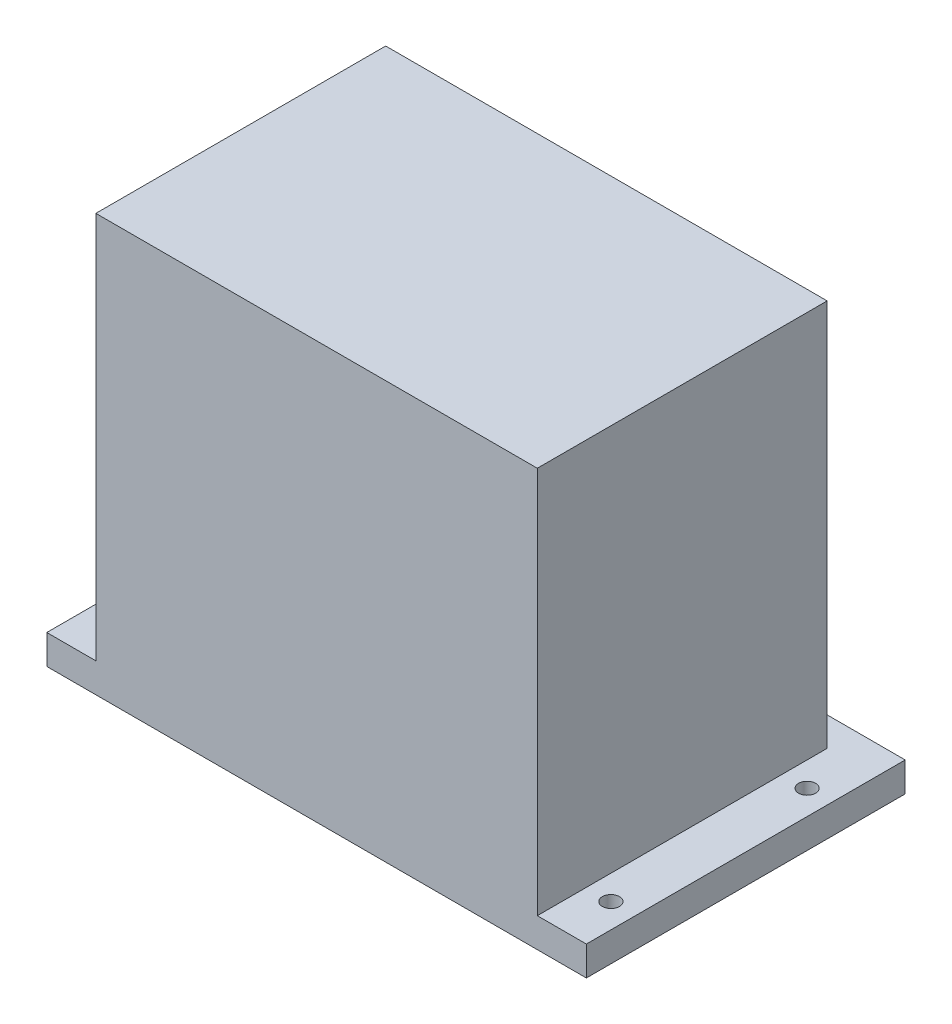
ISO-10303-21;
HEADER;
FILE_DESCRIPTION(('STEP AP214'),'2;1');
FILE_NAME('part.step','',(''),(''),'','','');
FILE_SCHEMA(('AUTOMOTIVE_DESIGN { 1 0 10303 214 1 1 1 1 }'));
ENDSEC;
DATA;
#1=APPLICATION_CONTEXT('core data for automotive mechanical design processes');
#2=APPLICATION_PROTOCOL_DEFINITION('international standard','automotive_design',2000,#1);
#3=PRODUCT_CONTEXT('',#1,'mechanical');
#4=PRODUCT('Part','Part','',(#3));
#5=PRODUCT_RELATED_PRODUCT_CATEGORY('part','',(#4));
#6=PRODUCT_DEFINITION_FORMATION('','',#4);
#7=PRODUCT_DEFINITION_CONTEXT('part definition',#1,'design');
#8=PRODUCT_DEFINITION('design','',#6,#7);
#9=PRODUCT_DEFINITION_SHAPE('','',#8);
#10=(LENGTH_UNIT() NAMED_UNIT(*) SI_UNIT(.MILLI.,.METRE.));
#11=(NAMED_UNIT(*) PLANE_ANGLE_UNIT() SI_UNIT($,.RADIAN.));
#12=(NAMED_UNIT(*) SI_UNIT($,.STERADIAN.) SOLID_ANGLE_UNIT());
#13=UNCERTAINTY_MEASURE_WITH_UNIT(LENGTH_MEASURE(1.E-05),#10,'distance_accuracy_value','');
#14=(GEOMETRIC_REPRESENTATION_CONTEXT(3) GLOBAL_UNCERTAINTY_ASSIGNED_CONTEXT((#13)) GLOBAL_UNIT_ASSIGNED_CONTEXT((#10,
#11,#12)) REPRESENTATION_CONTEXT('',''));
#15=CARTESIAN_POINT('',(0.,0.,0.));
#16=DIRECTION('',(0.,0.,1.));
#17=DIRECTION('',(1.,0.,0.));
#18=AXIS2_PLACEMENT_3D('',#15,#16,#17);
#19=CARTESIAN_POINT('',(55.,6.,0.));
#20=DIRECTION('',(-1.,0.,0.));
#21=DIRECTION('',(0.,0.,1.));
#22=AXIS2_PLACEMENT_3D('',#19,#20,#21);
#23=PLANE('',#22);
#24=DIRECTION('',(0.,0.,-1.));
#25=VECTOR('',#24,1.);
#26=CARTESIAN_POINT('',(55.,0.,0.));
#27=LINE('',#26,#25);
#28=CARTESIAN_POINT('',(55.,0.,32.5));
#29=VERTEX_POINT('',#28);
#30=CARTESIAN_POINT('',(55.,0.,-32.5));
#31=VERTEX_POINT('',#30);
#32=EDGE_CURVE('E199',#29,#31,#27,.T.);
#33=ORIENTED_EDGE('',*,*,#32,.T.);
#34=DIRECTION('',(0.,-1.,0.));
#35=VECTOR('',#34,1.);
#36=CARTESIAN_POINT('',(55.,6.,-32.5));
#37=LINE('',#36,#35);
#38=CARTESIAN_POINT('',(55.,6.,-32.5));
#39=VERTEX_POINT('',#38);
#40=EDGE_CURVE('E53',#39,#31,#37,.T.);
#41=ORIENTED_EDGE('',*,*,#40,.F.);
#42=DIRECTION('',(0.,0.,-1.));
#43=VECTOR('',#42,1.);
#44=CARTESIAN_POINT('',(55.,6.,0.));
#45=LINE('',#44,#43);
#46=CARTESIAN_POINT('',(55.,6.,32.5));
#47=VERTEX_POINT('',#46);
#48=EDGE_CURVE('E332',#47,#39,#45,.T.);
#49=ORIENTED_EDGE('',*,*,#48,.F.);
#50=DIRECTION('',(0.,-1.,0.));
#51=VECTOR('',#50,1.);
#52=CARTESIAN_POINT('',(55.,6.,32.5));
#53=LINE('',#52,#51);
#54=EDGE_CURVE('E11',#47,#29,#53,.T.);
#55=ORIENTED_EDGE('',*,*,#54,.T.);
#56=EDGE_LOOP('',(#33,#41,#49,#55));
#57=FACE_BOUND('',#56,.T.);
#58=ADVANCED_FACE('F43',(#57),#23,.F.);
#59=CARTESIAN_POINT('',(0.,6.,-32.5));
#60=DIRECTION('',(0.,0.,-1.));
#61=DIRECTION('',(-1.,0.,0.));
#62=AXIS2_PLACEMENT_3D('',#59,#60,#61);
#63=PLANE('',#62);
#64=DIRECTION('',(1.,0.,0.));
#65=VECTOR('',#64,1.);
#66=CARTESIAN_POINT('',(0.,0.,-32.5));
#67=LINE('',#66,#65);
#68=CARTESIAN_POINT('',(35.,0.,-32.5));
#69=VERTEX_POINT('',#68);
#70=EDGE_CURVE('E207',#69,#31,#67,.T.);
#71=ORIENTED_EDGE('',*,*,#70,.F.);
#72=DIRECTION('',(0.,-1.,0.));
#73=VECTOR('',#72,1.);
#74=CARTESIAN_POINT('',(35.,6.,-32.5));
#75=LINE('',#74,#73);
#76=CARTESIAN_POINT('',(35.,6.,-32.5));
#77=VERTEX_POINT('',#76);
#78=EDGE_CURVE('E268',#77,#69,#75,.T.);
#79=ORIENTED_EDGE('',*,*,#78,.F.);
#80=DIRECTION('',(1.,0.,0.));
#81=VECTOR('',#80,1.);
#82=CARTESIAN_POINT('',(0.,6.,-32.5));
#83=LINE('',#82,#81);
#84=EDGE_CURVE('E277',#77,#39,#83,.T.);
#85=ORIENTED_EDGE('',*,*,#84,.T.);
#86=ORIENTED_EDGE('',*,*,#40,.T.);
#87=EDGE_LOOP('',(#71,#79,#85,#86));
#88=FACE_BOUND('',#87,.T.);
#89=ADVANCED_FACE('F275',(#88),#63,.T.);
#90=CARTESIAN_POINT('',(35.,6.,0.));
#91=DIRECTION('',(1.,0.,0.));
#92=DIRECTION('',(0.,0.,-1.));
#93=AXIS2_PLACEMENT_3D('',#90,#91,#92);
#94=PLANE('',#93);
#95=DIRECTION('',(0.,0.,1.));
#96=VECTOR('',#95,1.);
#97=CARTESIAN_POINT('',(35.,0.,0.));
#98=LINE('',#97,#96);
#99=CARTESIAN_POINT('',(35.,0.,-27.5));
#100=VERTEX_POINT('',#99);
#101=EDGE_CURVE('E211',#69,#100,#98,.T.);
#102=ORIENTED_EDGE('',*,*,#101,.T.);
#103=DIRECTION('',(0.,-1.,0.));
#104=VECTOR('',#103,1.);
#105=CARTESIAN_POINT('',(35.,6.,-27.5));
#106=LINE('',#105,#104);
#107=CARTESIAN_POINT('',(35.,6.,-27.5));
#108=VERTEX_POINT('',#107);
#109=EDGE_CURVE('E264',#108,#100,#106,.T.);
#110=ORIENTED_EDGE('',*,*,#109,.F.);
#111=DIRECTION('',(0.,0.,1.));
#112=VECTOR('',#111,1.);
#113=CARTESIAN_POINT('',(35.,6.,0.));
#114=LINE('',#113,#112);
#115=EDGE_CURVE('E300',#77,#108,#114,.T.);
#116=ORIENTED_EDGE('',*,*,#115,.F.);
#117=ORIENTED_EDGE('',*,*,#78,.T.);
#118=EDGE_LOOP('',(#102,#110,#116,#117));
#119=FACE_BOUND('',#118,.T.);
#120=ADVANCED_FACE('F290',(#119),#94,.F.);
#121=CARTESIAN_POINT('',(0.,6.,-27.5));
#122=DIRECTION('',(0.,0.,1.));
#123=DIRECTION('',(1.,0.,0.));
#124=AXIS2_PLACEMENT_3D('',#121,#122,#123);
#125=PLANE('',#124);
#126=DIRECTION('',(-1.,0.,0.));
#127=VECTOR('',#126,1.);
#128=CARTESIAN_POINT('',(0.,0.,-27.5));
#129=LINE('',#128,#127);
#130=CARTESIAN_POINT('',(15.,0.,-27.5));
#131=VERTEX_POINT('',#130);
#132=EDGE_CURVE('E214',#100,#131,#129,.T.);
#133=ORIENTED_EDGE('',*,*,#132,.T.);
#134=DIRECTION('',(0.,-1.,0.));
#135=VECTOR('',#134,1.);
#136=CARTESIAN_POINT('',(15.,6.,-27.5));
#137=LINE('',#136,#135);
#138=CARTESIAN_POINT('',(15.,6.,-27.5));
#139=VERTEX_POINT('',#138);
#140=EDGE_CURVE('E260',#139,#131,#137,.T.);
#141=ORIENTED_EDGE('',*,*,#140,.F.);
#142=DIRECTION('',(-1.,0.,0.));
#143=VECTOR('',#142,1.);
#144=CARTESIAN_POINT('',(0.,6.,-27.5));
#145=LINE('',#144,#143);
#146=EDGE_CURVE('E296',#108,#139,#145,.T.);
#147=ORIENTED_EDGE('',*,*,#146,.F.);
#148=ORIENTED_EDGE('',*,*,#109,.T.);
#149=EDGE_LOOP('',(#133,#141,#147,#148));
#150=FACE_BOUND('',#149,.T.);
#151=ADVANCED_FACE('F294',(#150),#125,.F.);
#152=CARTESIAN_POINT('',(15.,6.,0.));
#153=DIRECTION('',(-1.,0.,0.));
#154=DIRECTION('',(0.,0.,1.));
#155=AXIS2_PLACEMENT_3D('',#152,#153,#154);
#156=PLANE('',#155);
#157=DIRECTION('',(0.,0.,-1.));
#158=VECTOR('',#157,1.);
#159=CARTESIAN_POINT('',(15.,0.,0.));
#160=LINE('',#159,#158);
#161=CARTESIAN_POINT('',(15.,0.,-32.5));
#162=VERTEX_POINT('',#161);
#163=EDGE_CURVE('E217',#131,#162,#160,.T.);
#164=ORIENTED_EDGE('',*,*,#163,.T.);
#165=DIRECTION('',(0.,-1.,0.));
#166=VECTOR('',#165,1.);
#167=CARTESIAN_POINT('',(15.,6.,-32.5));
#168=LINE('',#167,#166);
#169=CARTESIAN_POINT('',(15.,6.,-32.5));
#170=VERTEX_POINT('',#169);
#171=EDGE_CURVE('E257',#170,#162,#168,.T.);
#172=ORIENTED_EDGE('',*,*,#171,.F.);
#173=DIRECTION('',(0.,0.,-1.));
#174=VECTOR('',#173,1.);
#175=CARTESIAN_POINT('',(15.,6.,0.));
#176=LINE('',#175,#174);
#177=EDGE_CURVE('E299',#139,#170,#176,.T.);
#178=ORIENTED_EDGE('',*,*,#177,.F.);
#179=ORIENTED_EDGE('',*,*,#140,.T.);
#180=EDGE_LOOP('',(#164,#172,#178,#179));
#181=FACE_BOUND('',#180,.T.);
#182=ADVANCED_FACE('F472',(#181),#156,.F.);
#183=CARTESIAN_POINT('',(0.,6.,-32.5));
#184=DIRECTION('',(0.,0.,-1.));
#185=DIRECTION('',(-1.,0.,0.));
#186=AXIS2_PLACEMENT_3D('',#183,#184,#185);
#187=PLANE('',#186);
#188=DIRECTION('',(1.,0.,0.));
#189=VECTOR('',#188,1.);
#190=CARTESIAN_POINT('',(0.,0.,-32.5));
#191=LINE('',#190,#189);
#192=CARTESIAN_POINT('',(-15.,0.,-32.5));
#193=VERTEX_POINT('',#192);
#194=EDGE_CURVE('E221',#193,#162,#191,.T.);
#195=ORIENTED_EDGE('',*,*,#194,.F.);
#196=DIRECTION('',(0.,-1.,0.));
#197=VECTOR('',#196,1.);
#198=CARTESIAN_POINT('',(-15.,6.,-32.5));
#199=LINE('',#198,#197);
#200=CARTESIAN_POINT('',(-15.,6.,-32.5));
#201=VERTEX_POINT('',#200);
#202=EDGE_CURVE('E254',#201,#193,#199,.T.);
#203=ORIENTED_EDGE('',*,*,#202,.F.);
#204=DIRECTION('',(1.,0.,0.));
#205=VECTOR('',#204,1.);
#206=CARTESIAN_POINT('',(0.,6.,-32.5));
#207=LINE('',#206,#205);
#208=EDGE_CURVE('E304',#201,#170,#207,.T.);
#209=ORIENTED_EDGE('',*,*,#208,.T.);
#210=ORIENTED_EDGE('',*,*,#171,.T.);
#211=EDGE_LOOP('',(#195,#203,#209,#210));
#212=FACE_BOUND('',#211,.T.);
#213=ADVANCED_FACE('F468',(#212),#187,.T.);
#214=CARTESIAN_POINT('',(-15.,6.,0.));
#215=DIRECTION('',(-1.,0.,0.));
#216=DIRECTION('',(0.,0.,1.));
#217=AXIS2_PLACEMENT_3D('',#214,#215,#216);
#218=PLANE('',#217);
#219=DIRECTION('',(0.,0.,-1.));
#220=VECTOR('',#219,1.);
#221=CARTESIAN_POINT('',(-15.,0.,0.));
#222=LINE('',#221,#220);
#223=CARTESIAN_POINT('',(-15.,0.,-27.5));
#224=VERTEX_POINT('',#223);
#225=EDGE_CURVE('E225',#224,#193,#222,.T.);
#226=ORIENTED_EDGE('',*,*,#225,.F.);
#227=DIRECTION('',(0.,-1.,0.));
#228=VECTOR('',#227,1.);
#229=CARTESIAN_POINT('',(-15.,6.,-27.5));
#230=LINE('',#229,#228);
#231=CARTESIAN_POINT('',(-15.,6.,-27.5));
#232=VERTEX_POINT('',#231);
#233=EDGE_CURVE('E251',#232,#224,#230,.T.);
#234=ORIENTED_EDGE('',*,*,#233,.F.);
#235=DIRECTION('',(0.,0.,-1.));
#236=VECTOR('',#235,1.);
#237=CARTESIAN_POINT('',(-15.,6.,0.));
#238=LINE('',#237,#236);
#239=EDGE_CURVE('E312',#232,#201,#238,.T.);
#240=ORIENTED_EDGE('',*,*,#239,.T.);
#241=ORIENTED_EDGE('',*,*,#202,.T.);
#242=EDGE_LOOP('',(#226,#234,#240,#241));
#243=FACE_BOUND('',#242,.T.);
#244=ADVANCED_FACE('F464',(#243),#218,.T.);
#245=CARTESIAN_POINT('',(0.,6.,-27.5));
#246=DIRECTION('',(0.,0.,-1.));
#247=DIRECTION('',(-1.,0.,0.));
#248=AXIS2_PLACEMENT_3D('',#245,#246,#247);
#249=PLANE('',#248);
#250=DIRECTION('',(1.,0.,0.));
#251=VECTOR('',#250,1.);
#252=CARTESIAN_POINT('',(0.,0.,-27.5));
#253=LINE('',#252,#251);
#254=CARTESIAN_POINT('',(-35.,0.,-27.5));
#255=VERTEX_POINT('',#254);
#256=EDGE_CURVE('E229',#255,#224,#253,.T.);
#257=ORIENTED_EDGE('',*,*,#256,.F.);
#258=DIRECTION('',(0.,-1.,0.));
#259=VECTOR('',#258,1.);
#260=CARTESIAN_POINT('',(-35.,6.,-27.5));
#261=LINE('',#260,#259);
#262=CARTESIAN_POINT('',(-35.,6.,-27.5));
#263=VERTEX_POINT('',#262);
#264=EDGE_CURVE('E248',#263,#255,#261,.T.);
#265=ORIENTED_EDGE('',*,*,#264,.F.);
#266=DIRECTION('',(1.,0.,0.));
#267=VECTOR('',#266,1.);
#268=CARTESIAN_POINT('',(0.,6.,-27.5));
#269=LINE('',#268,#267);
#270=EDGE_CURVE('E316',#263,#232,#269,.T.);
#271=ORIENTED_EDGE('',*,*,#270,.T.);
#272=ORIENTED_EDGE('',*,*,#233,.T.);
#273=EDGE_LOOP('',(#257,#265,#271,#272));
#274=FACE_BOUND('',#273,.T.);
#275=ADVANCED_FACE('F461',(#274),#249,.T.);
#276=CARTESIAN_POINT('',(-35.,6.,0.));
#277=DIRECTION('',(1.,0.,0.));
#278=DIRECTION('',(0.,0.,-1.));
#279=AXIS2_PLACEMENT_3D('',#276,#277,#278);
#280=PLANE('',#279);
#281=DIRECTION('',(0.,0.,1.));
#282=VECTOR('',#281,1.);
#283=CARTESIAN_POINT('',(-35.,0.,0.));
#284=LINE('',#283,#282);
#285=CARTESIAN_POINT('',(-35.,0.,-32.5));
#286=VERTEX_POINT('',#285);
#287=EDGE_CURVE('E233',#286,#255,#284,.T.);
#288=ORIENTED_EDGE('',*,*,#287,.F.);
#289=DIRECTION('',(0.,-1.,0.));
#290=VECTOR('',#289,1.);
#291=CARTESIAN_POINT('',(-35.,6.,-32.5));
#292=LINE('',#291,#290);
#293=CARTESIAN_POINT('',(-35.,6.,-32.5));
#294=VERTEX_POINT('',#293);
#295=EDGE_CURVE('E245',#294,#286,#292,.T.);
#296=ORIENTED_EDGE('',*,*,#295,.F.);
#297=DIRECTION('',(0.,0.,1.));
#298=VECTOR('',#297,1.);
#299=CARTESIAN_POINT('',(-35.,6.,0.));
#300=LINE('',#299,#298);
#301=EDGE_CURVE('E176',#294,#263,#300,.T.);
#302=ORIENTED_EDGE('',*,*,#301,.T.);
#303=ORIENTED_EDGE('',*,*,#264,.T.);
#304=EDGE_LOOP('',(#288,#296,#302,#303));
#305=FACE_BOUND('',#304,.T.);
#306=ADVANCED_FACE('F323',(#305),#280,.T.);
#307=CARTESIAN_POINT('',(0.,6.,-32.5));
#308=DIRECTION('',(0.,0.,-1.));
#309=DIRECTION('',(-1.,0.,0.));
#310=AXIS2_PLACEMENT_3D('',#307,#308,#309);
#311=PLANE('',#310);
#312=DIRECTION('',(1.,0.,0.));
#313=VECTOR('',#312,1.);
#314=CARTESIAN_POINT('',(0.,0.,-32.5));
#315=LINE('',#314,#313);
#316=CARTESIAN_POINT('',(-55.,0.,-32.5));
#317=VERTEX_POINT('',#316);
#318=EDGE_CURVE('E237',#317,#286,#315,.T.);
#319=ORIENTED_EDGE('',*,*,#318,.F.);
#320=DIRECTION('',(0.,-1.,0.));
#321=VECTOR('',#320,1.);
#322=CARTESIAN_POINT('',(-55.,6.,-32.5));
#323=LINE('',#322,#321);
#324=CARTESIAN_POINT('',(-55.,6.,-32.5));
#325=VERTEX_POINT('',#324);
#326=EDGE_CURVE('E103',#325,#317,#323,.T.);
#327=ORIENTED_EDGE('',*,*,#326,.F.);
#328=DIRECTION('',(1.,0.,0.));
#329=VECTOR('',#328,1.);
#330=CARTESIAN_POINT('',(0.,6.,-32.5));
#331=LINE('',#330,#329);
#332=EDGE_CURVE('E172',#325,#294,#331,.T.);
#333=ORIENTED_EDGE('',*,*,#332,.T.);
#334=ORIENTED_EDGE('',*,*,#295,.T.);
#335=EDGE_LOOP('',(#319,#327,#333,#334));
#336=FACE_BOUND('',#335,.T.);
#337=ADVANCED_FACE('F328',(#336),#311,.T.);
#338=CARTESIAN_POINT('',(-55.,6.,0.));
#339=DIRECTION('',(-1.,0.,0.));
#340=DIRECTION('',(0.,0.,1.));
#341=AXIS2_PLACEMENT_3D('',#338,#339,#340);
#342=PLANE('',#341);
#343=DIRECTION('',(0.,0.,-1.));
#344=VECTOR('',#343,1.);
#345=CARTESIAN_POINT('',(-55.,0.,0.));
#346=LINE('',#345,#344);
#347=CARTESIAN_POINT('',(-55.,0.,32.5));
#348=VERTEX_POINT('',#347);
#349=EDGE_CURVE('E156',#348,#317,#346,.T.);
#350=ORIENTED_EDGE('',*,*,#349,.F.);
#351=DIRECTION('',(0.,-1.,0.));
#352=VECTOR('',#351,1.);
#353=CARTESIAN_POINT('',(-55.,6.,32.5));
#354=LINE('',#353,#352);
#355=CARTESIAN_POINT('',(-55.,6.,32.5));
#356=VERTEX_POINT('',#355);
#357=EDGE_CURVE('E110',#356,#348,#354,.T.);
#358=ORIENTED_EDGE('',*,*,#357,.F.);
#359=DIRECTION('',(0.,0.,-1.));
#360=VECTOR('',#359,1.);
#361=CARTESIAN_POINT('',(-55.,6.,0.));
#362=LINE('',#361,#360);
#363=EDGE_CURVE('E154',#356,#325,#362,.T.);
#364=ORIENTED_EDGE('',*,*,#363,.T.);
#365=ORIENTED_EDGE('',*,*,#326,.T.);
#366=EDGE_LOOP('',(#350,#358,#364,#365));
#367=FACE_BOUND('',#366,.T.);
#368=ADVANCED_FACE('F152',(#367),#342,.T.);
#369=CARTESIAN_POINT('',(0.,6.,32.5));
#370=DIRECTION('',(0.,0.,-1.));
#371=DIRECTION('',(-1.,0.,0.));
#372=AXIS2_PLACEMENT_3D('',#369,#370,#371);
#373=PLANE('',#372);
#374=DIRECTION('',(1.,0.,0.));
#375=VECTOR('',#374,1.);
#376=CARTESIAN_POINT('',(0.,0.,32.5));
#377=LINE('',#376,#375);
#378=EDGE_CURVE('E200',#348,#29,#377,.T.);
#379=ORIENTED_EDGE('',*,*,#378,.T.);
#380=ORIENTED_EDGE('',*,*,#54,.F.);
#381=DIRECTION('',(1.,0.,0.));
#382=VECTOR('',#381,1.);
#383=CARTESIAN_POINT('',(0.,6.,32.5));
#384=LINE('',#383,#382);
#385=CARTESIAN_POINT('',(45.,6.,32.5));
#386=VERTEX_POINT('',#385);
#387=EDGE_CURVE('E167',#386,#47,#384,.T.);
#388=ORIENTED_EDGE('',*,*,#387,.F.);
#389=DIRECTION('',(0.,-1.,0.));
#390=VECTOR('',#389,1.);
#391=CARTESIAN_POINT('',(45.,85.,32.5));
#392=LINE('',#391,#390);
#393=CARTESIAN_POINT('',(45.,85.,32.5));
#394=VERTEX_POINT('',#393);
#395=EDGE_CURVE('E367',#394,#386,#392,.T.);
#396=ORIENTED_EDGE('',*,*,#395,.F.);
#397=DIRECTION('',(1.,0.,0.));
#398=VECTOR('',#397,1.);
#399=CARTESIAN_POINT('',(0.,85.,32.5));
#400=LINE('',#399,#398);
#401=CARTESIAN_POINT('',(-45.,85.,32.5));
#402=VERTEX_POINT('',#401);
#403=EDGE_CURVE('E370',#402,#394,#400,.T.);
#404=ORIENTED_EDGE('',*,*,#403,.F.);
#405=DIRECTION('',(0.,-1.,0.));
#406=VECTOR('',#405,1.);
#407=CARTESIAN_POINT('',(-45.,85.,32.5));
#408=LINE('',#407,#406);
#409=CARTESIAN_POINT('',(-45.,6.,32.5));
#410=VERTEX_POINT('',#409);
#411=EDGE_CURVE('E164',#402,#410,#408,.T.);
#412=ORIENTED_EDGE('',*,*,#411,.T.);
#413=EDGE_CURVE('E160',#356,#410,#384,.T.);
#414=ORIENTED_EDGE('',*,*,#413,.F.);
#415=ORIENTED_EDGE('',*,*,#357,.T.);
#416=EDGE_LOOP('',(#379,#380,#388,#396,#404,#412,#414,#415));
#417=FACE_BOUND('',#416,.T.);
#418=ADVANCED_FACE('F161',(#417),#373,.F.);
#419=CARTESIAN_POINT('',(50.,6.,-17.5));
#420=DIRECTION('',(0.,-1.,0.));
#421=DIRECTION('',(0.,0.,-1.));
#422=AXIS2_PLACEMENT_3D('',#419,#420,#421);
#423=CYLINDRICAL_SURFACE('',#422,1.75);
#424=CARTESIAN_POINT('',(50.,6.,-17.5));
#425=DIRECTION('',(0.,1.,0.));
#426=DIRECTION('',(0.,0.,1.));
#427=AXIS2_PLACEMENT_3D('',#424,#425,#426);
#428=CIRCLE('',#427,1.75);
#429=CARTESIAN_POINT('',(50.,6.,-15.75));
#430=VERTEX_POINT('',#429);
#431=EDGE_CURVE('E343',#430,#430,#428,.T.);
#432=ORIENTED_EDGE('',*,*,#431,.T.);
#433=EDGE_LOOP('',(#432));
#434=FACE_BOUND('',#433,.T.);
#435=CARTESIAN_POINT('',(50.,0.,-17.5));
#436=DIRECTION('',(0.,1.,0.));
#437=DIRECTION('',(0.,0.,1.));
#438=AXIS2_PLACEMENT_3D('',#435,#436,#437);
#439=CIRCLE('',#438,1.75);
#440=CARTESIAN_POINT('',(50.,0.,-15.75));
#441=VERTEX_POINT('',#440);
#442=EDGE_CURVE('E195',#441,#441,#439,.T.);
#443=ORIENTED_EDGE('',*,*,#442,.F.);
#444=EDGE_LOOP('',(#443));
#445=FACE_BOUND('',#444,.T.);
#446=ADVANCED_FACE('F419',(#434,#445),#423,.F.);
#447=CARTESIAN_POINT('',(50.,6.,22.5));
#448=DIRECTION('',(0.,-1.,0.));
#449=DIRECTION('',(0.,0.,-1.));
#450=AXIS2_PLACEMENT_3D('',#447,#448,#449);
#451=CYLINDRICAL_SURFACE('',#450,1.75);
#452=CARTESIAN_POINT('',(50.,6.,22.5));
#453=DIRECTION('',(0.,1.,0.));
#454=DIRECTION('',(0.,0.,1.));
#455=AXIS2_PLACEMENT_3D('',#452,#453,#454);
#456=CIRCLE('',#455,1.75);
#457=CARTESIAN_POINT('',(50.,6.,24.25));
#458=VERTEX_POINT('',#457);
#459=EDGE_CURVE('E347',#458,#458,#456,.T.);
#460=ORIENTED_EDGE('',*,*,#459,.T.);
#461=EDGE_LOOP('',(#460));
#462=FACE_BOUND('',#461,.T.);
#463=CARTESIAN_POINT('',(50.,0.,22.5));
#464=DIRECTION('',(0.,1.,0.));
#465=DIRECTION('',(0.,0.,1.));
#466=AXIS2_PLACEMENT_3D('',#463,#464,#465);
#467=CIRCLE('',#466,1.75);
#468=CARTESIAN_POINT('',(50.,0.,24.25));
#469=VERTEX_POINT('',#468);
#470=EDGE_CURVE('E191',#469,#469,#467,.T.);
#471=ORIENTED_EDGE('',*,*,#470,.F.);
#472=EDGE_LOOP('',(#471));
#473=FACE_BOUND('',#472,.T.);
#474=ADVANCED_FACE('F422',(#462,#473),#451,.F.);
#475=CARTESIAN_POINT('',(-50.,6.,22.5));
#476=DIRECTION('',(0.,-1.,0.));
#477=DIRECTION('',(0.,0.,-1.));
#478=AXIS2_PLACEMENT_3D('',#475,#476,#477);
#479=CYLINDRICAL_SURFACE('',#478,1.75);
#480=CARTESIAN_POINT('',(-50.,6.,22.5));
#481=DIRECTION('',(0.,1.,0.));
#482=DIRECTION('',(0.,0.,1.));
#483=AXIS2_PLACEMENT_3D('',#480,#481,#482);
#484=CIRCLE('',#483,1.75);
#485=CARTESIAN_POINT('',(-50.,6.,24.25));
#486=VERTEX_POINT('',#485);
#487=EDGE_CURVE('E351',#486,#486,#484,.T.);
#488=ORIENTED_EDGE('',*,*,#487,.T.);
#489=EDGE_LOOP('',(#488));
#490=FACE_BOUND('',#489,.T.);
#491=CARTESIAN_POINT('',(-50.,0.,22.5));
#492=DIRECTION('',(0.,1.,0.));
#493=DIRECTION('',(0.,0.,1.));
#494=AXIS2_PLACEMENT_3D('',#491,#492,#493);
#495=CIRCLE('',#494,1.75);
#496=CARTESIAN_POINT('',(-50.,0.,24.25));
#497=VERTEX_POINT('',#496);
#498=EDGE_CURVE('E186',#497,#497,#495,.T.);
#499=ORIENTED_EDGE('',*,*,#498,.F.);
#500=EDGE_LOOP('',(#499));
#501=FACE_BOUND('',#500,.T.);
#502=ADVANCED_FACE('F425',(#490,#501),#479,.F.);
#503=CARTESIAN_POINT('',(-50.,6.,-17.5));
#504=DIRECTION('',(0.,-1.,0.));
#505=DIRECTION('',(0.,0.,-1.));
#506=AXIS2_PLACEMENT_3D('',#503,#504,#505);
#507=CYLINDRICAL_SURFACE('',#506,1.75);
#508=CARTESIAN_POINT('',(-50.,6.,-17.5));
#509=DIRECTION('',(0.,1.,0.));
#510=DIRECTION('',(0.,0.,1.));
#511=AXIS2_PLACEMENT_3D('',#508,#509,#510);
#512=CIRCLE('',#511,1.75);
#513=CARTESIAN_POINT('',(-50.,6.,-15.75));
#514=VERTEX_POINT('',#513);
#515=EDGE_CURVE('E203',#514,#514,#512,.T.);
#516=ORIENTED_EDGE('',*,*,#515,.T.);
#517=EDGE_LOOP('',(#516));
#518=FACE_BOUND('',#517,.T.);
#519=CARTESIAN_POINT('',(-50.,0.,-17.5));
#520=DIRECTION('',(0.,1.,0.));
#521=DIRECTION('',(0.,0.,1.));
#522=AXIS2_PLACEMENT_3D('',#519,#520,#521);
#523=CIRCLE('',#522,1.75);
#524=CARTESIAN_POINT('',(-50.,0.,-15.75));
#525=VERTEX_POINT('',#524);
#526=EDGE_CURVE('E182',#525,#525,#523,.T.);
#527=ORIENTED_EDGE('',*,*,#526,.F.);
#528=EDGE_LOOP('',(#527));
#529=FACE_BOUND('',#528,.T.);
#530=ADVANCED_FACE('F45',(#518,#529),#507,.F.);
#531=CARTESIAN_POINT('',(0.,6.,0.));
#532=DIRECTION('',(0.,1.,0.));
#533=DIRECTION('',(0.,0.,1.));
#534=AXIS2_PLACEMENT_3D('',#531,#532,#533);
#535=PLANE('',#534);
#536=ORIENTED_EDGE('',*,*,#515,.F.);
#537=EDGE_LOOP('',(#536));
#538=FACE_BOUND('',#537,.T.);
#539=ORIENTED_EDGE('',*,*,#487,.F.);
#540=EDGE_LOOP('',(#539));
#541=FACE_BOUND('',#540,.T.);
#542=ORIENTED_EDGE('',*,*,#459,.F.);
#543=EDGE_LOOP('',(#542));
#544=FACE_BOUND('',#543,.T.);
#545=ORIENTED_EDGE('',*,*,#431,.F.);
#546=EDGE_LOOP('',(#545));
#547=FACE_BOUND('',#546,.T.);
#548=DIRECTION('',(1.,0.,0.));
#549=VECTOR('',#548,1.);
#550=CARTESIAN_POINT('',(0.,6.,-26.5909090909091));
#551=LINE('',#550,#549);
#552=CARTESIAN_POINT('',(-45.,6.,-26.5909090909091));
#553=VERTEX_POINT('',#552);
#554=CARTESIAN_POINT('',(45.,6.,-26.5909090909091));
#555=VERTEX_POINT('',#554);
#556=EDGE_CURVE('E115',#553,#555,#551,.T.);
#557=ORIENTED_EDGE('',*,*,#556,.T.);
#558=DIRECTION('',(0.,0.,1.));
#559=VECTOR('',#558,1.);
#560=CARTESIAN_POINT('',(45.,6.,0.));
#561=LINE('',#560,#559);
#562=EDGE_CURVE('E337',#555,#386,#561,.T.);
#563=ORIENTED_EDGE('',*,*,#562,.T.);
#564=ORIENTED_EDGE('',*,*,#387,.T.);
#565=ORIENTED_EDGE('',*,*,#48,.T.);
#566=ORIENTED_EDGE('',*,*,#84,.F.);
#567=ORIENTED_EDGE('',*,*,#115,.T.);
#568=ORIENTED_EDGE('',*,*,#146,.T.);
#569=ORIENTED_EDGE('',*,*,#177,.T.);
#570=ORIENTED_EDGE('',*,*,#208,.F.);
#571=ORIENTED_EDGE('',*,*,#239,.F.);
#572=ORIENTED_EDGE('',*,*,#270,.F.);
#573=ORIENTED_EDGE('',*,*,#301,.F.);
#574=ORIENTED_EDGE('',*,*,#332,.F.);
#575=ORIENTED_EDGE('',*,*,#363,.F.);
#576=ORIENTED_EDGE('',*,*,#413,.T.);
#577=DIRECTION('',(0.,0.,-1.));
#578=VECTOR('',#577,1.);
#579=CARTESIAN_POINT('',(-45.,6.,0.));
#580=LINE('',#579,#578);
#581=EDGE_CURVE('E61',#410,#553,#580,.T.);
#582=ORIENTED_EDGE('',*,*,#581,.T.);
#583=EDGE_LOOP('',(#557,#563,#564,#565,#566,#567,#568,#569,#570,#571,#572,#573,#574,#575,#576,#582));
#584=FACE_BOUND('',#583,.T.);
#585=ADVANCED_FACE('F169',(#538,#541,#544,#547,#584),#535,.T.);
#586=CARTESIAN_POINT('',(0.,0.,0.));
#587=DIRECTION('',(0.,1.,0.));
#588=DIRECTION('',(0.,0.,1.));
#589=AXIS2_PLACEMENT_3D('',#586,#587,#588);
#590=PLANE('',#589);
#591=ORIENTED_EDGE('',*,*,#32,.F.);
#592=ORIENTED_EDGE('',*,*,#378,.F.);
#593=ORIENTED_EDGE('',*,*,#349,.T.);
#594=ORIENTED_EDGE('',*,*,#318,.T.);
#595=ORIENTED_EDGE('',*,*,#287,.T.);
#596=ORIENTED_EDGE('',*,*,#256,.T.);
#597=ORIENTED_EDGE('',*,*,#225,.T.);
#598=ORIENTED_EDGE('',*,*,#194,.T.);
#599=ORIENTED_EDGE('',*,*,#163,.F.);
#600=ORIENTED_EDGE('',*,*,#132,.F.);
#601=ORIENTED_EDGE('',*,*,#101,.F.);
#602=ORIENTED_EDGE('',*,*,#70,.T.);
#603=EDGE_LOOP('',(#591,#592,#593,#594,#595,#596,#597,#598,#599,#600,#601,#602));
#604=FACE_BOUND('',#603,.T.);
#605=ORIENTED_EDGE('',*,*,#526,.T.);
#606=EDGE_LOOP('',(#605));
#607=FACE_BOUND('',#606,.T.);
#608=ORIENTED_EDGE('',*,*,#498,.T.);
#609=EDGE_LOOP('',(#608));
#610=FACE_BOUND('',#609,.T.);
#611=ORIENTED_EDGE('',*,*,#470,.T.);
#612=EDGE_LOOP('',(#611));
#613=FACE_BOUND('',#612,.T.);
#614=ORIENTED_EDGE('',*,*,#442,.T.);
#615=EDGE_LOOP('',(#614));
#616=FACE_BOUND('',#615,.T.);
#617=ADVANCED_FACE('F284',(#604,#607,#610,#613,#616),#590,.F.);
#618=CARTESIAN_POINT('',(45.,85.,0.));
#619=DIRECTION('',(1.,0.,0.));
#620=DIRECTION('',(0.,0.,-1.));
#621=AXIS2_PLACEMENT_3D('',#618,#619,#620);
#622=PLANE('',#621);
#623=ORIENTED_EDGE('',*,*,#395,.T.);
#624=ORIENTED_EDGE('',*,*,#562,.F.);
#625=DIRECTION('',(0.,-1.,0.));
#626=VECTOR('',#625,1.);
#627=CARTESIAN_POINT('',(45.,85.,-26.5909090909091));
#628=LINE('',#627,#626);
#629=CARTESIAN_POINT('',(45.,85.,-26.5909090909091));
#630=VERTEX_POINT('',#629);
#631=EDGE_CURVE('E187',#630,#555,#628,.T.);
#632=ORIENTED_EDGE('',*,*,#631,.F.);
#633=DIRECTION('',(0.,0.,1.));
#634=VECTOR('',#633,1.);
#635=CARTESIAN_POINT('',(45.,85.,0.));
#636=LINE('',#635,#634);
#637=EDGE_CURVE('E382',#630,#394,#636,.T.);
#638=ORIENTED_EDGE('',*,*,#637,.T.);
#639=EDGE_LOOP('',(#623,#624,#632,#638));
#640=FACE_BOUND('',#639,.T.);
#641=ADVANCED_FACE('F388',(#640),#622,.T.);
#642=CARTESIAN_POINT('',(0.,85.,-26.5909090909091));
#643=DIRECTION('',(0.,0.,-1.));
#644=DIRECTION('',(-1.,0.,0.));
#645=AXIS2_PLACEMENT_3D('',#642,#643,#644);
#646=PLANE('',#645);
#647=ORIENTED_EDGE('',*,*,#631,.T.);
#648=ORIENTED_EDGE('',*,*,#556,.F.);
#649=DIRECTION('',(0.,-1.,0.));
#650=VECTOR('',#649,1.);
#651=CARTESIAN_POINT('',(-45.,85.,-26.5909090909091));
#652=LINE('',#651,#650);
#653=CARTESIAN_POINT('',(-45.,85.,-26.5909090909091));
#654=VERTEX_POINT('',#653);
#655=EDGE_CURVE('E361',#654,#553,#652,.T.);
#656=ORIENTED_EDGE('',*,*,#655,.F.);
#657=DIRECTION('',(1.,0.,0.));
#658=VECTOR('',#657,1.);
#659=CARTESIAN_POINT('',(0.,85.,-26.5909090909091));
#660=LINE('',#659,#658);
#661=EDGE_CURVE('E378',#654,#630,#660,.T.);
#662=ORIENTED_EDGE('',*,*,#661,.T.);
#663=EDGE_LOOP('',(#647,#648,#656,#662));
#664=FACE_BOUND('',#663,.T.);
#665=ADVANCED_FACE('F399',(#664),#646,.T.);
#666=CARTESIAN_POINT('',(-45.,85.,0.));
#667=DIRECTION('',(-1.,0.,0.));
#668=DIRECTION('',(0.,0.,1.));
#669=AXIS2_PLACEMENT_3D('',#666,#667,#668);
#670=PLANE('',#669);
#671=ORIENTED_EDGE('',*,*,#655,.T.);
#672=ORIENTED_EDGE('',*,*,#581,.F.);
#673=ORIENTED_EDGE('',*,*,#411,.F.);
#674=DIRECTION('',(0.,0.,-1.));
#675=VECTOR('',#674,1.);
#676=CARTESIAN_POINT('',(-45.,85.,0.));
#677=LINE('',#676,#675);
#678=EDGE_CURVE('E374',#402,#654,#677,.T.);
#679=ORIENTED_EDGE('',*,*,#678,.T.);
#680=EDGE_LOOP('',(#671,#672,#673,#679));
#681=FACE_BOUND('',#680,.T.);
#682=ADVANCED_FACE('F402',(#681),#670,.T.);
#683=CARTESIAN_POINT('',(0.,85.,0.));
#684=DIRECTION('',(0.,1.,0.));
#685=DIRECTION('',(0.,0.,1.));
#686=AXIS2_PLACEMENT_3D('',#683,#684,#685);
#687=PLANE('',#686);
#688=ORIENTED_EDGE('',*,*,#637,.F.);
#689=ORIENTED_EDGE('',*,*,#661,.F.);
#690=ORIENTED_EDGE('',*,*,#678,.F.);
#691=ORIENTED_EDGE('',*,*,#403,.T.);
#692=EDGE_LOOP('',(#688,#689,#690,#691));
#693=FACE_BOUND('',#692,.T.);
#694=ADVANCED_FACE('F393',(#693),#687,.T.);
#695=CLOSED_SHELL('',(#58,#89,#120,#151,#182,#213,#244,#275,#306,#337,#368,#418,#446,#474,#502,
#530,#585,#617,#641,#665,#682,#694));
#696=MANIFOLD_SOLID_BREP('B2',#695);
#697=ADVANCED_BREP_SHAPE_REPRESENTATION('',(#18,#696),#14);
#698=SHAPE_DEFINITION_REPRESENTATION(#9,#697);
ENDSEC;
END-ISO-10303-21;
